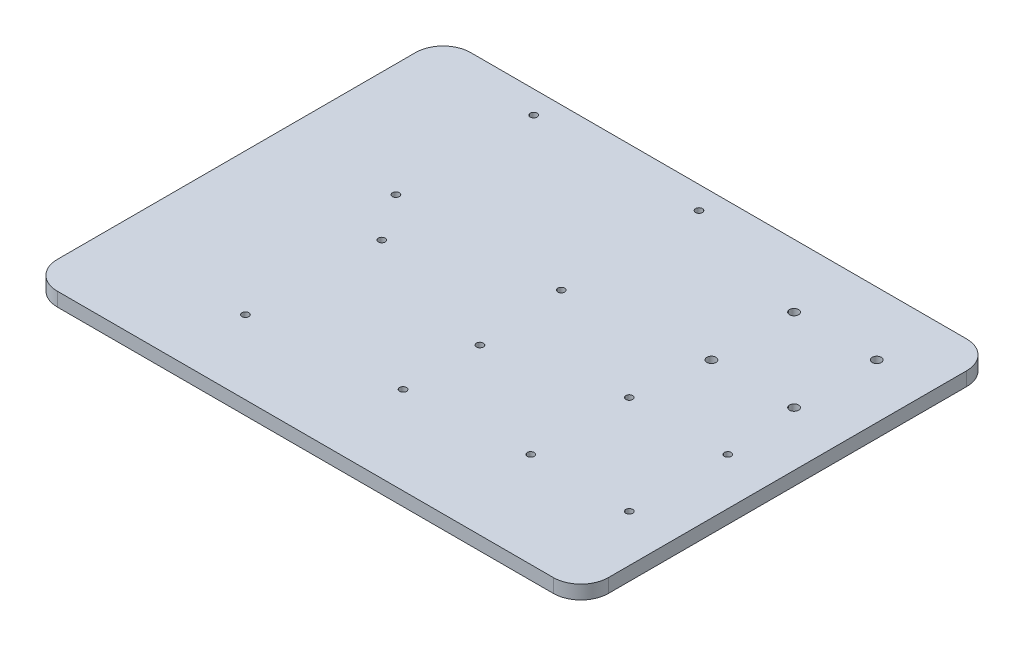
ISO-10303-21;
HEADER;
FILE_DESCRIPTION(('STEP AP214'),'2;1');
FILE_NAME('part.step','',(''),(''),'','','');
FILE_SCHEMA(('AUTOMOTIVE_DESIGN { 1 0 10303 214 1 1 1 1 }'));
ENDSEC;
DATA;
#1=APPLICATION_CONTEXT('core data for automotive mechanical design processes');
#2=APPLICATION_PROTOCOL_DEFINITION('international standard','automotive_design',2000,#1);
#3=PRODUCT_CONTEXT('',#1,'mechanical');
#4=PRODUCT('Part','Part','',(#3));
#5=PRODUCT_RELATED_PRODUCT_CATEGORY('part','',(#4));
#6=PRODUCT_DEFINITION_FORMATION('','',#4);
#7=PRODUCT_DEFINITION_CONTEXT('part definition',#1,'design');
#8=PRODUCT_DEFINITION('design','',#6,#7);
#9=PRODUCT_DEFINITION_SHAPE('','',#8);
#10=(LENGTH_UNIT() NAMED_UNIT(*) SI_UNIT(.MILLI.,.METRE.));
#11=(NAMED_UNIT(*) PLANE_ANGLE_UNIT() SI_UNIT($,.RADIAN.));
#12=(NAMED_UNIT(*) SI_UNIT($,.STERADIAN.) SOLID_ANGLE_UNIT());
#13=UNCERTAINTY_MEASURE_WITH_UNIT(LENGTH_MEASURE(1.E-05),#10,'distance_accuracy_value','');
#14=(GEOMETRIC_REPRESENTATION_CONTEXT(3) GLOBAL_UNCERTAINTY_ASSIGNED_CONTEXT((#13)) GLOBAL_UNIT_ASSIGNED_CONTEXT((#10,
#11,#12)) REPRESENTATION_CONTEXT('',''));
#15=CARTESIAN_POINT('',(0.,0.,0.));
#16=DIRECTION('',(0.,0.,1.));
#17=DIRECTION('',(1.,0.,0.));
#18=AXIS2_PLACEMENT_3D('',#15,#16,#17);
#19=CARTESIAN_POINT('',(-90.0000000000001,0.,65.));
#20=DIRECTION('',(0.,-1.,0.));
#21=DIRECTION('',(0.,0.,-1.));
#22=AXIS2_PLACEMENT_3D('',#19,#20,#21);
#23=PLANE('',#22);
#24=CARTESIAN_POINT('',(-58.9099004654203,0.,-16.7747922849964));
#25=DIRECTION('',(0.,1.,0.));
#26=DIRECTION('',(0.,0.,1.));
#27=AXIS2_PLACEMENT_3D('',#24,#25,#26);
#28=CIRCLE('',#27,1.25);
#29=CARTESIAN_POINT('',(-58.9099004654203,0.,-15.5247922849964));
#30=VERTEX_POINT('',#29);
#31=EDGE_CURVE('E272',#30,#30,#28,.T.);
#32=ORIENTED_EDGE('',*,*,#31,.T.);
#33=EDGE_LOOP('',(#32));
#34=FACE_BOUND('',#33,.T.);
#35=CARTESIAN_POINT('',(1.09009953457967,0.,-16.7747922849964));
#36=DIRECTION('',(0.,1.,0.));
#37=DIRECTION('',(0.,0.,1.));
#38=AXIS2_PLACEMENT_3D('',#35,#36,#37);
#39=CIRCLE('',#38,1.25);
#40=CARTESIAN_POINT('',(1.09009953457967,0.,-15.5247922849964));
#41=VERTEX_POINT('',#40);
#42=EDGE_CURVE('E266',#41,#41,#39,.T.);
#43=ORIENTED_EDGE('',*,*,#42,.T.);
#44=EDGE_LOOP('',(#43));
#45=FACE_BOUND('',#44,.T.);
#46=CARTESIAN_POINT('',(1.0900995345795,0.,-66.7747922849964));
#47=DIRECTION('',(0.,1.,0.));
#48=DIRECTION('',(0.,0.,1.));
#49=AXIS2_PLACEMENT_3D('',#46,#47,#48);
#50=CIRCLE('',#49,1.25);
#51=CARTESIAN_POINT('',(1.0900995345795,0.,-65.5247922849964));
#52=VERTEX_POINT('',#51);
#53=EDGE_CURVE('E260',#52,#52,#50,.T.);
#54=ORIENTED_EDGE('',*,*,#53,.T.);
#55=EDGE_LOOP('',(#54));
#56=FACE_BOUND('',#55,.T.);
#57=CARTESIAN_POINT('',(-90.0000000000001,0.,65.));
#58=DIRECTION('',(0.,-1.,0.));
#59=DIRECTION('',(0.,0.,-1.));
#60=AXIS2_PLACEMENT_3D('',#57,#58,#59);
#61=CIRCLE('',#60,9.99999999999999);
#62=CARTESIAN_POINT('',(-90.0000000000001,0.,75.));
#63=VERTEX_POINT('',#62);
#64=CARTESIAN_POINT('',(-100.,0.,65.));
#65=VERTEX_POINT('',#64);
#66=EDGE_CURVE('E136',#63,#65,#61,.T.);
#67=ORIENTED_EDGE('',*,*,#66,.T.);
#68=DIRECTION('',(0.,0.,-1.));
#69=VECTOR('',#68,1.);
#70=CARTESIAN_POINT('',(-100.,0.,65.));
#71=LINE('',#70,#69);
#72=CARTESIAN_POINT('',(-100.,0.,-65.));
#73=VERTEX_POINT('',#72);
#74=EDGE_CURVE('E139',#65,#73,#71,.T.);
#75=ORIENTED_EDGE('',*,*,#74,.T.);
#76=CARTESIAN_POINT('',(-90.0000000000001,0.,-65.));
#77=DIRECTION('',(0.,-1.,0.));
#78=DIRECTION('',(0.,0.,-1.));
#79=AXIS2_PLACEMENT_3D('',#76,#77,#78);
#80=CIRCLE('',#79,9.99999999999999);
#81=CARTESIAN_POINT('',(-90.0000000000001,0.,-75.));
#82=VERTEX_POINT('',#81);
#83=EDGE_CURVE('E143',#73,#82,#80,.T.);
#84=ORIENTED_EDGE('',*,*,#83,.T.);
#85=DIRECTION('',(1.,0.,0.));
#86=VECTOR('',#85,1.);
#87=CARTESIAN_POINT('',(-90.0000000000001,0.,-75.));
#88=LINE('',#87,#86);
#89=CARTESIAN_POINT('',(90.,0.,-75.));
#90=VERTEX_POINT('',#89);
#91=EDGE_CURVE('E146',#82,#90,#88,.T.);
#92=ORIENTED_EDGE('',*,*,#91,.T.);
#93=CARTESIAN_POINT('',(90.,0.,-65.));
#94=DIRECTION('',(0.,-1.,0.));
#95=DIRECTION('',(0.,0.,-1.));
#96=AXIS2_PLACEMENT_3D('',#93,#94,#95);
#97=CIRCLE('',#96,10.);
#98=CARTESIAN_POINT('',(100.,0.,-65.));
#99=VERTEX_POINT('',#98);
#100=EDGE_CURVE('E149',#90,#99,#97,.T.);
#101=ORIENTED_EDGE('',*,*,#100,.T.);
#102=DIRECTION('',(0.,0.,-1.));
#103=VECTOR('',#102,1.);
#104=CARTESIAN_POINT('',(100.,0.,65.));
#105=LINE('',#104,#103);
#106=CARTESIAN_POINT('',(100.,0.,65.));
#107=VERTEX_POINT('',#106);
#108=EDGE_CURVE('E152',#107,#99,#105,.T.);
#109=ORIENTED_EDGE('',*,*,#108,.F.);
#110=CARTESIAN_POINT('',(90.,0.,65.));
#111=DIRECTION('',(0.,1.,0.));
#112=DIRECTION('',(0.,0.,1.));
#113=AXIS2_PLACEMENT_3D('',#110,#111,#112);
#114=CIRCLE('',#113,10.);
#115=CARTESIAN_POINT('',(90.,0.,75.));
#116=VERTEX_POINT('',#115);
#117=EDGE_CURVE('E121',#116,#107,#114,.T.);
#118=ORIENTED_EDGE('',*,*,#117,.F.);
#119=DIRECTION('',(1.,0.,0.));
#120=VECTOR('',#119,1.);
#121=CARTESIAN_POINT('',(-90.0000000000001,0.,75.));
#122=LINE('',#121,#120);
#123=EDGE_CURVE('E81',#63,#116,#122,.T.);
#124=ORIENTED_EDGE('',*,*,#123,.F.);
#125=EDGE_LOOP('',(#67,#75,#84,#92,#101,#109,#118,#124));
#126=FACE_BOUND('',#125,.T.);
#127=CARTESIAN_POINT('',(-48.490955355582,0.,48.2497848916603));
#128=DIRECTION('',(0.,1.,0.));
#129=DIRECTION('',(0.,0.,1.));
#130=AXIS2_PLACEMENT_3D('',#127,#128,#129);
#131=CIRCLE('',#130,1.25);
#132=CARTESIAN_POINT('',(-48.490955355582,0.,49.4997848916603));
#133=VERTEX_POINT('',#132);
#134=EDGE_CURVE('E140',#133,#133,#131,.T.);
#135=ORIENTED_EDGE('',*,*,#134,.T.);
#136=EDGE_LOOP('',(#135));
#137=FACE_BOUND('',#136,.T.);
#138=CARTESIAN_POINT('',(-47.190955355582,0.,0.0497848916603538));
#139=DIRECTION('',(0.,1.,0.));
#140=DIRECTION('',(0.,0.,1.));
#141=AXIS2_PLACEMENT_3D('',#138,#139,#140);
#142=CIRCLE('',#141,1.25);
#143=CARTESIAN_POINT('',(-47.190955355582,0.,1.29978489166035));
#144=VERTEX_POINT('',#143);
#145=EDGE_CURVE('E188',#144,#144,#142,.T.);
#146=ORIENTED_EDGE('',*,*,#145,.T.);
#147=EDGE_LOOP('',(#146));
#148=FACE_BOUND('',#147,.T.);
#149=CARTESIAN_POINT('',(3.60904464441801,0.,43.1497848916604));
#150=DIRECTION('',(0.,1.,0.));
#151=DIRECTION('',(0.,0.,1.));
#152=AXIS2_PLACEMENT_3D('',#149,#150,#151);
#153=CIRCLE('',#152,1.25);
#154=CARTESIAN_POINT('',(3.60904464441801,0.,44.3997848916604));
#155=VERTEX_POINT('',#154);
#156=EDGE_CURVE('E194',#155,#155,#153,.T.);
#157=ORIENTED_EDGE('',*,*,#156,.T.);
#158=EDGE_LOOP('',(#157));
#159=FACE_BOUND('',#158,.T.);
#160=CARTESIAN_POINT('',(3.60904464441801,0.,15.2497848916603));
#161=DIRECTION('',(0.,1.,0.));
#162=DIRECTION('',(0.,0.,1.));
#163=AXIS2_PLACEMENT_3D('',#160,#161,#162);
#164=CIRCLE('',#163,1.25);
#165=CARTESIAN_POINT('',(3.60904464441801,0.,16.4997848916603));
#166=VERTEX_POINT('',#165);
#167=EDGE_CURVE('E200',#166,#166,#164,.T.);
#168=ORIENTED_EDGE('',*,*,#167,.T.);
#169=EDGE_LOOP('',(#168));
#170=FACE_BOUND('',#169,.T.);
#171=CARTESIAN_POINT('',(47.2018733772672,0.,4.64918051198569));
#172=DIRECTION('',(0.,1.,0.));
#173=DIRECTION('',(0.,0.,1.));
#174=AXIS2_PLACEMENT_3D('',#171,#172,#173);
#175=CIRCLE('',#174,1.24999999999999);
#176=CARTESIAN_POINT('',(47.2018733772672,0.,5.89918051198568));
#177=VERTEX_POINT('',#176);
#178=EDGE_CURVE('E206',#177,#177,#175,.T.);
#179=ORIENTED_EDGE('',*,*,#178,.T.);
#180=EDGE_LOOP('',(#179));
#181=FACE_BOUND('',#180,.T.);
#182=CARTESIAN_POINT('',(82.9618733772672,0.,4.64918051198569));
#183=DIRECTION('',(0.,1.,0.));
#184=DIRECTION('',(0.,0.,1.));
#185=AXIS2_PLACEMENT_3D('',#182,#183,#184);
#186=CIRCLE('',#185,1.24999999999999);
#187=CARTESIAN_POINT('',(82.9618733772672,0.,5.89918051198568));
#188=VERTEX_POINT('',#187);
#189=EDGE_CURVE('E212',#188,#188,#186,.T.);
#190=ORIENTED_EDGE('',*,*,#189,.T.);
#191=EDGE_LOOP('',(#190));
#192=FACE_BOUND('',#191,.T.);
#193=CARTESIAN_POINT('',(82.9618733772674,0.,40.4091805119857));
#194=DIRECTION('',(0.,1.,0.));
#195=DIRECTION('',(0.,0.,1.));
#196=AXIS2_PLACEMENT_3D('',#193,#194,#195);
#197=CIRCLE('',#196,1.24999999999999);
#198=CARTESIAN_POINT('',(82.9618733772674,0.,41.6591805119857));
#199=VERTEX_POINT('',#198);
#200=EDGE_CURVE('E218',#199,#199,#197,.T.);
#201=ORIENTED_EDGE('',*,*,#200,.T.);
#202=EDGE_LOOP('',(#201));
#203=FACE_BOUND('',#202,.T.);
#204=CARTESIAN_POINT('',(47.2018733772674,0.,40.4091805119857));
#205=DIRECTION('',(0.,1.,0.));
#206=DIRECTION('',(0.,0.,1.));
#207=AXIS2_PLACEMENT_3D('',#204,#205,#206);
#208=CIRCLE('',#207,1.24999999999999);
#209=CARTESIAN_POINT('',(47.2018733772674,0.,41.6591805119857));
#210=VERTEX_POINT('',#209);
#211=EDGE_CURVE('E224',#210,#210,#208,.T.);
#212=ORIENTED_EDGE('',*,*,#211,.T.);
#213=EDGE_LOOP('',(#212));
#214=FACE_BOUND('',#213,.T.);
#215=CARTESIAN_POINT('',(50.2730350442184,0.,-52.0977986039124));
#216=DIRECTION('',(0.,1.,0.));
#217=DIRECTION('',(0.,0.,1.));
#218=AXIS2_PLACEMENT_3D('',#215,#216,#217);
#219=CIRCLE('',#218,1.65);
#220=CARTESIAN_POINT('',(50.2730350442184,0.,-50.4477986039124));
#221=VERTEX_POINT('',#220);
#222=EDGE_CURVE('E230',#221,#221,#219,.T.);
#223=ORIENTED_EDGE('',*,*,#222,.T.);
#224=EDGE_LOOP('',(#223));
#225=FACE_BOUND('',#224,.T.);
#226=CARTESIAN_POINT('',(80.2730350442184,0.,-52.0977986039124));
#227=DIRECTION('',(0.,1.,0.));
#228=DIRECTION('',(0.,0.,1.));
#229=AXIS2_PLACEMENT_3D('',#226,#227,#228);
#230=CIRCLE('',#229,1.65);
#231=CARTESIAN_POINT('',(80.2730350442184,0.,-50.4477986039124));
#232=VERTEX_POINT('',#231);
#233=EDGE_CURVE('E236',#232,#232,#230,.T.);
#234=ORIENTED_EDGE('',*,*,#233,.T.);
#235=EDGE_LOOP('',(#234));
#236=FACE_BOUND('',#235,.T.);
#237=CARTESIAN_POINT('',(80.2730350442185,0.,-22.0977986039124));
#238=DIRECTION('',(0.,1.,0.));
#239=DIRECTION('',(0.,0.,1.));
#240=AXIS2_PLACEMENT_3D('',#237,#238,#239);
#241=CIRCLE('',#240,1.65);
#242=CARTESIAN_POINT('',(80.2730350442185,0.,-20.4477986039124));
#243=VERTEX_POINT('',#242);
#244=EDGE_CURVE('E242',#243,#243,#241,.T.);
#245=ORIENTED_EDGE('',*,*,#244,.T.);
#246=EDGE_LOOP('',(#245));
#247=FACE_BOUND('',#246,.T.);
#248=CARTESIAN_POINT('',(50.2730350442185,0.,-22.0977986039124));
#249=DIRECTION('',(0.,1.,0.));
#250=DIRECTION('',(0.,0.,1.));
#251=AXIS2_PLACEMENT_3D('',#248,#249,#250);
#252=CIRCLE('',#251,1.65);
#253=CARTESIAN_POINT('',(50.2730350442185,0.,-20.4477986039124));
#254=VERTEX_POINT('',#253);
#255=EDGE_CURVE('E248',#254,#254,#252,.T.);
#256=ORIENTED_EDGE('',*,*,#255,.T.);
#257=EDGE_LOOP('',(#256));
#258=FACE_BOUND('',#257,.T.);
#259=CARTESIAN_POINT('',(-58.9099004654205,0.,-66.7747922849964));
#260=DIRECTION('',(0.,1.,0.));
#261=DIRECTION('',(0.,0.,1.));
#262=AXIS2_PLACEMENT_3D('',#259,#260,#261);
#263=CIRCLE('',#262,1.25);
#264=CARTESIAN_POINT('',(-58.9099004654205,0.,-65.5247922849964));
#265=VERTEX_POINT('',#264);
#266=EDGE_CURVE('E254',#265,#265,#263,.T.);
#267=ORIENTED_EDGE('',*,*,#266,.T.);
#268=EDGE_LOOP('',(#267));
#269=FACE_BOUND('',#268,.T.);
#270=ADVANCED_FACE('F35',(#34,#45,#56,#126,#137,#148,#159,#170,#181,#192,#203,#214,#225,#236,
#247,#258,#269),#23,.T.);
#271=CARTESIAN_POINT('',(-90.0000000000001,5.,65.));
#272=DIRECTION('',(0.,-1.,0.));
#273=DIRECTION('',(0.,0.,-1.));
#274=AXIS2_PLACEMENT_3D('',#271,#272,#273);
#275=PLANE('',#274);
#276=CARTESIAN_POINT('',(-58.9099004654203,5.,-16.7747922849964));
#277=DIRECTION('',(0.,1.,0.));
#278=DIRECTION('',(0.,0.,1.));
#279=AXIS2_PLACEMENT_3D('',#276,#277,#278);
#280=CIRCLE('',#279,1.24999999999999);
#281=CARTESIAN_POINT('',(-58.9099004654203,5.,-15.5247922849964));
#282=VERTEX_POINT('',#281);
#283=EDGE_CURVE('E275',#282,#282,#280,.T.);
#284=ORIENTED_EDGE('',*,*,#283,.F.);
#285=EDGE_LOOP('',(#284));
#286=FACE_BOUND('',#285,.T.);
#287=CARTESIAN_POINT('',(1.09009953457967,5.,-16.7747922849964));
#288=DIRECTION('',(0.,1.,0.));
#289=DIRECTION('',(0.,0.,1.));
#290=AXIS2_PLACEMENT_3D('',#287,#288,#289);
#291=CIRCLE('',#290,1.24999999999999);
#292=CARTESIAN_POINT('',(1.09009953457967,5.,-15.5247922849964));
#293=VERTEX_POINT('',#292);
#294=EDGE_CURVE('E269',#293,#293,#291,.T.);
#295=ORIENTED_EDGE('',*,*,#294,.F.);
#296=EDGE_LOOP('',(#295));
#297=FACE_BOUND('',#296,.T.);
#298=CARTESIAN_POINT('',(1.0900995345795,5.,-66.7747922849964));
#299=DIRECTION('',(0.,1.,0.));
#300=DIRECTION('',(0.,0.,1.));
#301=AXIS2_PLACEMENT_3D('',#298,#299,#300);
#302=CIRCLE('',#301,1.24999999999999);
#303=CARTESIAN_POINT('',(1.0900995345795,5.,-65.5247922849964));
#304=VERTEX_POINT('',#303);
#305=EDGE_CURVE('E263',#304,#304,#302,.T.);
#306=ORIENTED_EDGE('',*,*,#305,.F.);
#307=EDGE_LOOP('',(#306));
#308=FACE_BOUND('',#307,.T.);
#309=CARTESIAN_POINT('',(50.2730350442185,5.,-22.0977986039124));
#310=DIRECTION('',(0.,1.,0.));
#311=DIRECTION('',(0.,0.,1.));
#312=AXIS2_PLACEMENT_3D('',#309,#310,#311);
#313=CIRCLE('',#312,1.65);
#314=CARTESIAN_POINT('',(50.2730350442185,5.,-20.4477986039124));
#315=VERTEX_POINT('',#314);
#316=EDGE_CURVE('E251',#315,#315,#313,.T.);
#317=ORIENTED_EDGE('',*,*,#316,.F.);
#318=EDGE_LOOP('',(#317));
#319=FACE_BOUND('',#318,.T.);
#320=CARTESIAN_POINT('',(80.2730350442185,5.,-22.0977986039124));
#321=DIRECTION('',(0.,1.,0.));
#322=DIRECTION('',(0.,0.,1.));
#323=AXIS2_PLACEMENT_3D('',#320,#321,#322);
#324=CIRCLE('',#323,1.65);
#325=CARTESIAN_POINT('',(80.2730350442185,5.,-20.4477986039124));
#326=VERTEX_POINT('',#325);
#327=EDGE_CURVE('E245',#326,#326,#324,.T.);
#328=ORIENTED_EDGE('',*,*,#327,.F.);
#329=EDGE_LOOP('',(#328));
#330=FACE_BOUND('',#329,.T.);
#331=CARTESIAN_POINT('',(80.2730350442184,5.,-52.0977986039124));
#332=DIRECTION('',(0.,1.,0.));
#333=DIRECTION('',(0.,0.,1.));
#334=AXIS2_PLACEMENT_3D('',#331,#332,#333);
#335=CIRCLE('',#334,1.65);
#336=CARTESIAN_POINT('',(80.2730350442184,5.,-50.4477986039124));
#337=VERTEX_POINT('',#336);
#338=EDGE_CURVE('E239',#337,#337,#335,.T.);
#339=ORIENTED_EDGE('',*,*,#338,.F.);
#340=EDGE_LOOP('',(#339));
#341=FACE_BOUND('',#340,.T.);
#342=CARTESIAN_POINT('',(50.2730350442184,5.,-52.0977986039124));
#343=DIRECTION('',(0.,1.,0.));
#344=DIRECTION('',(0.,0.,1.));
#345=AXIS2_PLACEMENT_3D('',#342,#343,#344);
#346=CIRCLE('',#345,1.65);
#347=CARTESIAN_POINT('',(50.2730350442184,5.,-50.4477986039124));
#348=VERTEX_POINT('',#347);
#349=EDGE_CURVE('E233',#348,#348,#346,.T.);
#350=ORIENTED_EDGE('',*,*,#349,.F.);
#351=EDGE_LOOP('',(#350));
#352=FACE_BOUND('',#351,.T.);
#353=CARTESIAN_POINT('',(47.2018733772674,5.,40.4091805119857));
#354=DIRECTION('',(0.,1.,0.));
#355=DIRECTION('',(0.,0.,1.));
#356=AXIS2_PLACEMENT_3D('',#353,#354,#355);
#357=CIRCLE('',#356,1.24999999999999);
#358=CARTESIAN_POINT('',(47.2018733772674,5.,41.6591805119857));
#359=VERTEX_POINT('',#358);
#360=EDGE_CURVE('E227',#359,#359,#357,.T.);
#361=ORIENTED_EDGE('',*,*,#360,.F.);
#362=EDGE_LOOP('',(#361));
#363=FACE_BOUND('',#362,.T.);
#364=CARTESIAN_POINT('',(82.9618733772674,5.,40.4091805119857));
#365=DIRECTION('',(0.,1.,0.));
#366=DIRECTION('',(0.,0.,1.));
#367=AXIS2_PLACEMENT_3D('',#364,#365,#366);
#368=CIRCLE('',#367,1.24999999999999);
#369=CARTESIAN_POINT('',(82.9618733772674,5.,41.6591805119857));
#370=VERTEX_POINT('',#369);
#371=EDGE_CURVE('E221',#370,#370,#368,.T.);
#372=ORIENTED_EDGE('',*,*,#371,.F.);
#373=EDGE_LOOP('',(#372));
#374=FACE_BOUND('',#373,.T.);
#375=CARTESIAN_POINT('',(82.9618733772672,5.,4.64918051198569));
#376=DIRECTION('',(0.,1.,0.));
#377=DIRECTION('',(0.,0.,1.));
#378=AXIS2_PLACEMENT_3D('',#375,#376,#377);
#379=CIRCLE('',#378,1.24999999999999);
#380=CARTESIAN_POINT('',(82.9618733772672,5.,5.89918051198568));
#381=VERTEX_POINT('',#380);
#382=EDGE_CURVE('E215',#381,#381,#379,.T.);
#383=ORIENTED_EDGE('',*,*,#382,.F.);
#384=EDGE_LOOP('',(#383));
#385=FACE_BOUND('',#384,.T.);
#386=CARTESIAN_POINT('',(47.2018733772672,5.,4.64918051198569));
#387=DIRECTION('',(0.,1.,0.));
#388=DIRECTION('',(0.,0.,1.));
#389=AXIS2_PLACEMENT_3D('',#386,#387,#388);
#390=CIRCLE('',#389,1.24999999999999);
#391=CARTESIAN_POINT('',(47.2018733772672,5.,5.89918051198568));
#392=VERTEX_POINT('',#391);
#393=EDGE_CURVE('E209',#392,#392,#390,.T.);
#394=ORIENTED_EDGE('',*,*,#393,.F.);
#395=EDGE_LOOP('',(#394));
#396=FACE_BOUND('',#395,.T.);
#397=CARTESIAN_POINT('',(3.60904464441801,5.,15.2497848916603));
#398=DIRECTION('',(0.,1.,0.));
#399=DIRECTION('',(0.,0.,1.));
#400=AXIS2_PLACEMENT_3D('',#397,#398,#399);
#401=CIRCLE('',#400,1.25);
#402=CARTESIAN_POINT('',(3.60904464441801,5.,16.4997848916603));
#403=VERTEX_POINT('',#402);
#404=EDGE_CURVE('E203',#403,#403,#401,.T.);
#405=ORIENTED_EDGE('',*,*,#404,.F.);
#406=EDGE_LOOP('',(#405));
#407=FACE_BOUND('',#406,.T.);
#408=CARTESIAN_POINT('',(3.60904464441801,5.,43.1497848916604));
#409=DIRECTION('',(0.,1.,0.));
#410=DIRECTION('',(0.,0.,1.));
#411=AXIS2_PLACEMENT_3D('',#408,#409,#410);
#412=CIRCLE('',#411,1.25);
#413=CARTESIAN_POINT('',(3.60904464441801,5.,44.3997848916604));
#414=VERTEX_POINT('',#413);
#415=EDGE_CURVE('E197',#414,#414,#412,.T.);
#416=ORIENTED_EDGE('',*,*,#415,.F.);
#417=EDGE_LOOP('',(#416));
#418=FACE_BOUND('',#417,.T.);
#419=CARTESIAN_POINT('',(-47.190955355582,5.,0.0497848916603538));
#420=DIRECTION('',(0.,1.,0.));
#421=DIRECTION('',(0.,0.,1.));
#422=AXIS2_PLACEMENT_3D('',#419,#420,#421);
#423=CIRCLE('',#422,1.25);
#424=CARTESIAN_POINT('',(-47.190955355582,5.,1.29978489166035));
#425=VERTEX_POINT('',#424);
#426=EDGE_CURVE('E191',#425,#425,#423,.T.);
#427=ORIENTED_EDGE('',*,*,#426,.F.);
#428=EDGE_LOOP('',(#427));
#429=FACE_BOUND('',#428,.T.);
#430=CARTESIAN_POINT('',(-48.490955355582,5.,48.2497848916603));
#431=DIRECTION('',(0.,1.,0.));
#432=DIRECTION('',(0.,0.,1.));
#433=AXIS2_PLACEMENT_3D('',#430,#431,#432);
#434=CIRCLE('',#433,1.25);
#435=CARTESIAN_POINT('',(-48.490955355582,5.,49.4997848916603));
#436=VERTEX_POINT('',#435);
#437=EDGE_CURVE('E185',#436,#436,#434,.T.);
#438=ORIENTED_EDGE('',*,*,#437,.F.);
#439=EDGE_LOOP('',(#438));
#440=FACE_BOUND('',#439,.T.);
#441=CARTESIAN_POINT('',(-90.0000000000001,5.,65.));
#442=DIRECTION('',(0.,-1.,0.));
#443=DIRECTION('',(0.,0.,-1.));
#444=AXIS2_PLACEMENT_3D('',#441,#442,#443);
#445=CIRCLE('',#444,9.99999999999999);
#446=CARTESIAN_POINT('',(-90.0000000000001,5.,75.));
#447=VERTEX_POINT('',#446);
#448=CARTESIAN_POINT('',(-100.,5.,65.));
#449=VERTEX_POINT('',#448);
#450=EDGE_CURVE('E155',#447,#449,#445,.T.);
#451=ORIENTED_EDGE('',*,*,#450,.F.);
#452=DIRECTION('',(1.,0.,0.));
#453=VECTOR('',#452,1.);
#454=CARTESIAN_POINT('',(-90.0000000000001,5.,75.));
#455=LINE('',#454,#453);
#456=CARTESIAN_POINT('',(90.,5.,75.));
#457=VERTEX_POINT('',#456);
#458=EDGE_CURVE('E114',#447,#457,#455,.T.);
#459=ORIENTED_EDGE('',*,*,#458,.T.);
#460=CARTESIAN_POINT('',(90.,5.,65.));
#461=DIRECTION('',(0.,1.,0.));
#462=DIRECTION('',(0.,0.,1.));
#463=AXIS2_PLACEMENT_3D('',#460,#461,#462);
#464=CIRCLE('',#463,10.);
#465=CARTESIAN_POINT('',(100.,5.,65.));
#466=VERTEX_POINT('',#465);
#467=EDGE_CURVE('E105',#457,#466,#464,.T.);
#468=ORIENTED_EDGE('',*,*,#467,.T.);
#469=DIRECTION('',(0.,0.,-1.));
#470=VECTOR('',#469,1.);
#471=CARTESIAN_POINT('',(100.,5.,65.));
#472=LINE('',#471,#470);
#473=CARTESIAN_POINT('',(100.,5.,-65.));
#474=VERTEX_POINT('',#473);
#475=EDGE_CURVE('E112',#466,#474,#472,.T.);
#476=ORIENTED_EDGE('',*,*,#475,.T.);
#477=CARTESIAN_POINT('',(90.,5.,-65.));
#478=DIRECTION('',(0.,-1.,0.));
#479=DIRECTION('',(0.,0.,-1.));
#480=AXIS2_PLACEMENT_3D('',#477,#478,#479);
#481=CIRCLE('',#480,10.);
#482=CARTESIAN_POINT('',(90.,5.,-75.));
#483=VERTEX_POINT('',#482);
#484=EDGE_CURVE('E129',#483,#474,#481,.T.);
#485=ORIENTED_EDGE('',*,*,#484,.F.);
#486=DIRECTION('',(1.,0.,0.));
#487=VECTOR('',#486,1.);
#488=CARTESIAN_POINT('',(-90.0000000000001,5.,-75.));
#489=LINE('',#488,#487);
#490=CARTESIAN_POINT('',(-90.0000000000001,5.,-75.));
#491=VERTEX_POINT('',#490);
#492=EDGE_CURVE('E131',#491,#483,#489,.T.);
#493=ORIENTED_EDGE('',*,*,#492,.F.);
#494=CARTESIAN_POINT('',(-90.0000000000001,5.,-65.));
#495=DIRECTION('',(0.,-1.,0.));
#496=DIRECTION('',(0.,0.,-1.));
#497=AXIS2_PLACEMENT_3D('',#494,#495,#496);
#498=CIRCLE('',#497,9.99999999999999);
#499=CARTESIAN_POINT('',(-100.,5.,-65.));
#500=VERTEX_POINT('',#499);
#501=EDGE_CURVE('E177',#500,#491,#498,.T.);
#502=ORIENTED_EDGE('',*,*,#501,.F.);
#503=DIRECTION('',(0.,0.,-1.));
#504=VECTOR('',#503,1.);
#505=CARTESIAN_POINT('',(-100.,5.,65.));
#506=LINE('',#505,#504);
#507=EDGE_CURVE('E178',#449,#500,#506,.T.);
#508=ORIENTED_EDGE('',*,*,#507,.F.);
#509=EDGE_LOOP('',(#451,#459,#468,#476,#485,#493,#502,#508));
#510=FACE_BOUND('',#509,.T.);
#511=CARTESIAN_POINT('',(-58.9099004654205,5.,-66.7747922849964));
#512=DIRECTION('',(0.,1.,0.));
#513=DIRECTION('',(0.,0.,1.));
#514=AXIS2_PLACEMENT_3D('',#511,#512,#513);
#515=CIRCLE('',#514,1.24999999999999);
#516=CARTESIAN_POINT('',(-58.9099004654205,5.,-65.5247922849964));
#517=VERTEX_POINT('',#516);
#518=EDGE_CURVE('E257',#517,#517,#515,.T.);
#519=ORIENTED_EDGE('',*,*,#518,.F.);
#520=EDGE_LOOP('',(#519));
#521=FACE_BOUND('',#520,.T.);
#522=ADVANCED_FACE('F108',(#286,#297,#308,#319,#330,#341,#352,#363,#374,#385,#396,#407,#418,
#429,#440,#510,#521),#275,.F.);
#523=CARTESIAN_POINT('',(-90.0000000000001,5.,65.));
#524=DIRECTION('',(0.,-1.,0.));
#525=DIRECTION('',(0.,0.,-1.));
#526=AXIS2_PLACEMENT_3D('',#523,#524,#525);
#527=CYLINDRICAL_SURFACE('',#526,9.99999999999999);
#528=ORIENTED_EDGE('',*,*,#66,.F.);
#529=DIRECTION('',(0.,-1.,0.));
#530=VECTOR('',#529,1.);
#531=CARTESIAN_POINT('',(-90.0000000000001,5.,75.));
#532=LINE('',#531,#530);
#533=EDGE_CURVE('E11',#447,#63,#532,.T.);
#534=ORIENTED_EDGE('',*,*,#533,.F.);
#535=ORIENTED_EDGE('',*,*,#450,.T.);
#536=DIRECTION('',(0.,-1.,0.));
#537=VECTOR('',#536,1.);
#538=CARTESIAN_POINT('',(-100.,5.,65.));
#539=LINE('',#538,#537);
#540=EDGE_CURVE('E39',#449,#65,#539,.T.);
#541=ORIENTED_EDGE('',*,*,#540,.T.);
#542=EDGE_LOOP('',(#528,#534,#535,#541));
#543=FACE_BOUND('',#542,.T.);
#544=ADVANCED_FACE('F37',(#543),#527,.T.);
#545=CARTESIAN_POINT('',(-90.0000000000001,5.,75.));
#546=DIRECTION('',(0.,0.,-1.));
#547=DIRECTION('',(-1.,0.,0.));
#548=AXIS2_PLACEMENT_3D('',#545,#546,#547);
#549=PLANE('',#548);
#550=ORIENTED_EDGE('',*,*,#123,.T.);
#551=DIRECTION('',(0.,-1.,0.));
#552=VECTOR('',#551,1.);
#553=CARTESIAN_POINT('',(90.,5.,75.));
#554=LINE('',#553,#552);
#555=EDGE_CURVE('E45',#457,#116,#554,.T.);
#556=ORIENTED_EDGE('',*,*,#555,.F.);
#557=ORIENTED_EDGE('',*,*,#458,.F.);
#558=ORIENTED_EDGE('',*,*,#533,.T.);
#559=EDGE_LOOP('',(#550,#556,#557,#558));
#560=FACE_BOUND('',#559,.T.);
#561=ADVANCED_FACE('F333',(#560),#549,.F.);
#562=CARTESIAN_POINT('',(90.,5.,65.));
#563=DIRECTION('',(0.,-1.,0.));
#564=DIRECTION('',(0.,0.,-1.));
#565=AXIS2_PLACEMENT_3D('',#562,#563,#564);
#566=CYLINDRICAL_SURFACE('',#565,10.);
#567=ORIENTED_EDGE('',*,*,#117,.T.);
#568=DIRECTION('',(0.,-1.,0.));
#569=VECTOR('',#568,1.);
#570=CARTESIAN_POINT('',(100.,5.,65.));
#571=LINE('',#570,#569);
#572=EDGE_CURVE('E118',#466,#107,#571,.T.);
#573=ORIENTED_EDGE('',*,*,#572,.F.);
#574=ORIENTED_EDGE('',*,*,#467,.F.);
#575=ORIENTED_EDGE('',*,*,#555,.T.);
#576=EDGE_LOOP('',(#567,#573,#574,#575));
#577=FACE_BOUND('',#576,.T.);
#578=ADVANCED_FACE('F119',(#577),#566,.T.);
#579=CARTESIAN_POINT('',(100.,5.,65.));
#580=DIRECTION('',(-1.,0.,0.));
#581=DIRECTION('',(0.,0.,1.));
#582=AXIS2_PLACEMENT_3D('',#579,#580,#581);
#583=PLANE('',#582);
#584=ORIENTED_EDGE('',*,*,#108,.T.);
#585=DIRECTION('',(0.,-1.,0.));
#586=VECTOR('',#585,1.);
#587=CARTESIAN_POINT('',(100.,5.,-65.));
#588=LINE('',#587,#586);
#589=EDGE_CURVE('E125',#474,#99,#588,.T.);
#590=ORIENTED_EDGE('',*,*,#589,.F.);
#591=ORIENTED_EDGE('',*,*,#475,.F.);
#592=ORIENTED_EDGE('',*,*,#572,.T.);
#593=EDGE_LOOP('',(#584,#590,#591,#592));
#594=FACE_BOUND('',#593,.T.);
#595=ADVANCED_FACE('F127',(#594),#583,.F.);
#596=CARTESIAN_POINT('',(90.,5.,-65.));
#597=DIRECTION('',(0.,-1.,0.));
#598=DIRECTION('',(0.,0.,-1.));
#599=AXIS2_PLACEMENT_3D('',#596,#597,#598);
#600=CYLINDRICAL_SURFACE('',#599,10.);
#601=ORIENTED_EDGE('',*,*,#100,.F.);
#602=DIRECTION('',(0.,-1.,0.));
#603=VECTOR('',#602,1.);
#604=CARTESIAN_POINT('',(90.,5.,-75.));
#605=LINE('',#604,#603);
#606=EDGE_CURVE('E159',#483,#90,#605,.T.);
#607=ORIENTED_EDGE('',*,*,#606,.F.);
#608=ORIENTED_EDGE('',*,*,#484,.T.);
#609=ORIENTED_EDGE('',*,*,#589,.T.);
#610=EDGE_LOOP('',(#601,#607,#608,#609));
#611=FACE_BOUND('',#610,.T.);
#612=ADVANCED_FACE('F170',(#611),#600,.T.);
#613=CARTESIAN_POINT('',(-90.0000000000001,5.,-75.));
#614=DIRECTION('',(0.,0.,-1.));
#615=DIRECTION('',(-1.,0.,0.));
#616=AXIS2_PLACEMENT_3D('',#613,#614,#615);
#617=PLANE('',#616);
#618=ORIENTED_EDGE('',*,*,#91,.F.);
#619=DIRECTION('',(0.,-1.,0.));
#620=VECTOR('',#619,1.);
#621=CARTESIAN_POINT('',(-90.0000000000001,5.,-75.));
#622=LINE('',#621,#620);
#623=EDGE_CURVE('E161',#491,#82,#622,.T.);
#624=ORIENTED_EDGE('',*,*,#623,.F.);
#625=ORIENTED_EDGE('',*,*,#492,.T.);
#626=ORIENTED_EDGE('',*,*,#606,.T.);
#627=EDGE_LOOP('',(#618,#624,#625,#626));
#628=FACE_BOUND('',#627,.T.);
#629=ADVANCED_FACE('F176',(#628),#617,.T.);
#630=CARTESIAN_POINT('',(-90.0000000000001,5.,-65.));
#631=DIRECTION('',(0.,-1.,0.));
#632=DIRECTION('',(0.,0.,-1.));
#633=AXIS2_PLACEMENT_3D('',#630,#631,#632);
#634=CYLINDRICAL_SURFACE('',#633,9.99999999999999);
#635=ORIENTED_EDGE('',*,*,#83,.F.);
#636=DIRECTION('',(0.,-1.,0.));
#637=VECTOR('',#636,1.);
#638=CARTESIAN_POINT('',(-100.,5.,-65.));
#639=LINE('',#638,#637);
#640=EDGE_CURVE('E162',#500,#73,#639,.T.);
#641=ORIENTED_EDGE('',*,*,#640,.F.);
#642=ORIENTED_EDGE('',*,*,#501,.T.);
#643=ORIENTED_EDGE('',*,*,#623,.T.);
#644=EDGE_LOOP('',(#635,#641,#642,#643));
#645=FACE_BOUND('',#644,.T.);
#646=ADVANCED_FACE('F324',(#645),#634,.T.);
#647=CARTESIAN_POINT('',(-100.,5.,65.));
#648=DIRECTION('',(-1.,0.,0.));
#649=DIRECTION('',(0.,0.,1.));
#650=AXIS2_PLACEMENT_3D('',#647,#648,#649);
#651=PLANE('',#650);
#652=ORIENTED_EDGE('',*,*,#74,.F.);
#653=ORIENTED_EDGE('',*,*,#540,.F.);
#654=ORIENTED_EDGE('',*,*,#507,.T.);
#655=ORIENTED_EDGE('',*,*,#640,.T.);
#656=EDGE_LOOP('',(#652,#653,#654,#655));
#657=FACE_BOUND('',#656,.T.);
#658=ADVANCED_FACE('F164',(#657),#651,.T.);
#659=CARTESIAN_POINT('',(-48.490955355582,5.,48.2497848916603));
#660=DIRECTION('',(0.,1.,0.));
#661=DIRECTION('',(0.,0.,1.));
#662=AXIS2_PLACEMENT_3D('',#659,#660,#661);
#663=CYLINDRICAL_SURFACE('',#662,1.25);
#664=ORIENTED_EDGE('',*,*,#134,.F.);
#665=EDGE_LOOP('',(#664));
#666=FACE_BOUND('',#665,.T.);
#667=ORIENTED_EDGE('',*,*,#437,.T.);
#668=EDGE_LOOP('',(#667));
#669=FACE_BOUND('',#668,.T.);
#670=ADVANCED_FACE('F312',(#666,#669),#663,.F.);
#671=CARTESIAN_POINT('',(-47.190955355582,5.,0.0497848916603538));
#672=DIRECTION('',(0.,1.,0.));
#673=DIRECTION('',(0.,0.,1.));
#674=AXIS2_PLACEMENT_3D('',#671,#672,#673);
#675=CYLINDRICAL_SURFACE('',#674,1.25);
#676=ORIENTED_EDGE('',*,*,#145,.F.);
#677=EDGE_LOOP('',(#676));
#678=FACE_BOUND('',#677,.T.);
#679=ORIENTED_EDGE('',*,*,#426,.T.);
#680=EDGE_LOOP('',(#679));
#681=FACE_BOUND('',#680,.T.);
#682=ADVANCED_FACE('F314',(#678,#681),#675,.F.);
#683=CARTESIAN_POINT('',(3.60904464441801,5.,43.1497848916604));
#684=DIRECTION('',(0.,1.,0.));
#685=DIRECTION('',(0.,0.,1.));
#686=AXIS2_PLACEMENT_3D('',#683,#684,#685);
#687=CYLINDRICAL_SURFACE('',#686,1.25);
#688=ORIENTED_EDGE('',*,*,#156,.F.);
#689=EDGE_LOOP('',(#688));
#690=FACE_BOUND('',#689,.T.);
#691=ORIENTED_EDGE('',*,*,#415,.T.);
#692=EDGE_LOOP('',(#691));
#693=FACE_BOUND('',#692,.T.);
#694=ADVANCED_FACE('F321',(#690,#693),#687,.F.);
#695=CARTESIAN_POINT('',(3.60904464441801,5.,15.2497848916603));
#696=DIRECTION('',(0.,1.,0.));
#697=DIRECTION('',(0.,0.,1.));
#698=AXIS2_PLACEMENT_3D('',#695,#696,#697);
#699=CYLINDRICAL_SURFACE('',#698,1.25);
#700=ORIENTED_EDGE('',*,*,#167,.F.);
#701=EDGE_LOOP('',(#700));
#702=FACE_BOUND('',#701,.T.);
#703=ORIENTED_EDGE('',*,*,#404,.T.);
#704=EDGE_LOOP('',(#703));
#705=FACE_BOUND('',#704,.T.);
#706=ADVANCED_FACE('F377',(#702,#705),#699,.F.);
#707=CARTESIAN_POINT('',(47.2018733772672,5.,4.64918051198569));
#708=DIRECTION('',(0.,1.,0.));
#709=DIRECTION('',(0.,0.,1.));
#710=AXIS2_PLACEMENT_3D('',#707,#708,#709);
#711=CYLINDRICAL_SURFACE('',#710,1.24999999999999);
#712=ORIENTED_EDGE('',*,*,#178,.F.);
#713=EDGE_LOOP('',(#712));
#714=FACE_BOUND('',#713,.T.);
#715=ORIENTED_EDGE('',*,*,#393,.T.);
#716=EDGE_LOOP('',(#715));
#717=FACE_BOUND('',#716,.T.);
#718=ADVANCED_FACE('F388',(#714,#717),#711,.F.);
#719=CARTESIAN_POINT('',(82.9618733772672,5.,4.64918051198569));
#720=DIRECTION('',(0.,1.,0.));
#721=DIRECTION('',(0.,0.,1.));
#722=AXIS2_PLACEMENT_3D('',#719,#720,#721);
#723=CYLINDRICAL_SURFACE('',#722,1.24999999999999);
#724=ORIENTED_EDGE('',*,*,#189,.F.);
#725=EDGE_LOOP('',(#724));
#726=FACE_BOUND('',#725,.T.);
#727=ORIENTED_EDGE('',*,*,#382,.T.);
#728=EDGE_LOOP('',(#727));
#729=FACE_BOUND('',#728,.T.);
#730=ADVANCED_FACE('F399',(#726,#729),#723,.F.);
#731=CARTESIAN_POINT('',(82.9618733772674,5.,40.4091805119857));
#732=DIRECTION('',(0.,1.,0.));
#733=DIRECTION('',(0.,0.,1.));
#734=AXIS2_PLACEMENT_3D('',#731,#732,#733);
#735=CYLINDRICAL_SURFACE('',#734,1.24999999999999);
#736=ORIENTED_EDGE('',*,*,#200,.F.);
#737=EDGE_LOOP('',(#736));
#738=FACE_BOUND('',#737,.T.);
#739=ORIENTED_EDGE('',*,*,#371,.T.);
#740=EDGE_LOOP('',(#739));
#741=FACE_BOUND('',#740,.T.);
#742=ADVANCED_FACE('F410',(#738,#741),#735,.F.);
#743=CARTESIAN_POINT('',(47.2018733772674,5.,40.4091805119857));
#744=DIRECTION('',(0.,1.,0.));
#745=DIRECTION('',(0.,0.,1.));
#746=AXIS2_PLACEMENT_3D('',#743,#744,#745);
#747=CYLINDRICAL_SURFACE('',#746,1.24999999999999);
#748=ORIENTED_EDGE('',*,*,#211,.F.);
#749=EDGE_LOOP('',(#748));
#750=FACE_BOUND('',#749,.T.);
#751=ORIENTED_EDGE('',*,*,#360,.T.);
#752=EDGE_LOOP('',(#751));
#753=FACE_BOUND('',#752,.T.);
#754=ADVANCED_FACE('F421',(#750,#753),#747,.F.);
#755=CARTESIAN_POINT('',(50.2730350442184,5.,-52.0977986039124));
#756=DIRECTION('',(0.,1.,0.));
#757=DIRECTION('',(0.,0.,1.));
#758=AXIS2_PLACEMENT_3D('',#755,#756,#757);
#759=CYLINDRICAL_SURFACE('',#758,1.65);
#760=ORIENTED_EDGE('',*,*,#222,.F.);
#761=EDGE_LOOP('',(#760));
#762=FACE_BOUND('',#761,.T.);
#763=ORIENTED_EDGE('',*,*,#349,.T.);
#764=EDGE_LOOP('',(#763));
#765=FACE_BOUND('',#764,.T.);
#766=ADVANCED_FACE('F432',(#762,#765),#759,.F.);
#767=CARTESIAN_POINT('',(80.2730350442184,5.,-52.0977986039124));
#768=DIRECTION('',(0.,1.,0.));
#769=DIRECTION('',(0.,0.,1.));
#770=AXIS2_PLACEMENT_3D('',#767,#768,#769);
#771=CYLINDRICAL_SURFACE('',#770,1.65);
#772=ORIENTED_EDGE('',*,*,#233,.F.);
#773=EDGE_LOOP('',(#772));
#774=FACE_BOUND('',#773,.T.);
#775=ORIENTED_EDGE('',*,*,#338,.T.);
#776=EDGE_LOOP('',(#775));
#777=FACE_BOUND('',#776,.T.);
#778=ADVANCED_FACE('F444',(#774,#777),#771,.F.);
#779=CARTESIAN_POINT('',(80.2730350442185,5.,-22.0977986039124));
#780=DIRECTION('',(0.,1.,0.));
#781=DIRECTION('',(0.,0.,1.));
#782=AXIS2_PLACEMENT_3D('',#779,#780,#781);
#783=CYLINDRICAL_SURFACE('',#782,1.65);
#784=ORIENTED_EDGE('',*,*,#244,.F.);
#785=EDGE_LOOP('',(#784));
#786=FACE_BOUND('',#785,.T.);
#787=ORIENTED_EDGE('',*,*,#327,.T.);
#788=EDGE_LOOP('',(#787));
#789=FACE_BOUND('',#788,.T.);
#790=ADVANCED_FACE('F456',(#786,#789),#783,.F.);
#791=CARTESIAN_POINT('',(50.2730350442185,5.,-22.0977986039124));
#792=DIRECTION('',(0.,1.,0.));
#793=DIRECTION('',(0.,0.,1.));
#794=AXIS2_PLACEMENT_3D('',#791,#792,#793);
#795=CYLINDRICAL_SURFACE('',#794,1.65);
#796=ORIENTED_EDGE('',*,*,#255,.F.);
#797=EDGE_LOOP('',(#796));
#798=FACE_BOUND('',#797,.T.);
#799=ORIENTED_EDGE('',*,*,#316,.T.);
#800=EDGE_LOOP('',(#799));
#801=FACE_BOUND('',#800,.T.);
#802=ADVANCED_FACE('F467',(#798,#801),#795,.F.);
#803=CARTESIAN_POINT('',(-58.9099004654205,5.,-66.7747922849964));
#804=DIRECTION('',(0.,1.,0.));
#805=DIRECTION('',(0.,0.,1.));
#806=AXIS2_PLACEMENT_3D('',#803,#804,#805);
#807=CYLINDRICAL_SURFACE('',#806,1.24999999999999);
#808=ORIENTED_EDGE('',*,*,#266,.F.);
#809=EDGE_LOOP('',(#808));
#810=FACE_BOUND('',#809,.T.);
#811=ORIENTED_EDGE('',*,*,#518,.T.);
#812=EDGE_LOOP('',(#811));
#813=FACE_BOUND('',#812,.T.);
#814=ADVANCED_FACE('F476',(#810,#813),#807,.F.);
#815=CARTESIAN_POINT('',(1.0900995345795,5.,-66.7747922849964));
#816=DIRECTION('',(0.,1.,0.));
#817=DIRECTION('',(0.,0.,1.));
#818=AXIS2_PLACEMENT_3D('',#815,#816,#817);
#819=CYLINDRICAL_SURFACE('',#818,1.24999999999999);
#820=ORIENTED_EDGE('',*,*,#53,.F.);
#821=EDGE_LOOP('',(#820));
#822=FACE_BOUND('',#821,.T.);
#823=ORIENTED_EDGE('',*,*,#305,.T.);
#824=EDGE_LOOP('',(#823));
#825=FACE_BOUND('',#824,.T.);
#826=ADVANCED_FACE('F498',(#822,#825),#819,.F.);
#827=CARTESIAN_POINT('',(1.09009953457967,5.,-16.7747922849964));
#828=DIRECTION('',(0.,1.,0.));
#829=DIRECTION('',(0.,0.,1.));
#830=AXIS2_PLACEMENT_3D('',#827,#828,#829);
#831=CYLINDRICAL_SURFACE('',#830,1.24999999999999);
#832=ORIENTED_EDGE('',*,*,#42,.F.);
#833=EDGE_LOOP('',(#832));
#834=FACE_BOUND('',#833,.T.);
#835=ORIENTED_EDGE('',*,*,#294,.T.);
#836=EDGE_LOOP('',(#835));
#837=FACE_BOUND('',#836,.T.);
#838=ADVANCED_FACE('F508',(#834,#837),#831,.F.);
#839=CARTESIAN_POINT('',(-58.9099004654203,5.,-16.7747922849964));
#840=DIRECTION('',(0.,1.,0.));
#841=DIRECTION('',(0.,0.,1.));
#842=AXIS2_PLACEMENT_3D('',#839,#840,#841);
#843=CYLINDRICAL_SURFACE('',#842,1.24999999999999);
#844=ORIENTED_EDGE('',*,*,#31,.F.);
#845=EDGE_LOOP('',(#844));
#846=FACE_BOUND('',#845,.T.);
#847=ORIENTED_EDGE('',*,*,#283,.T.);
#848=EDGE_LOOP('',(#847));
#849=FACE_BOUND('',#848,.T.);
#850=ADVANCED_FACE('F279',(#846,#849),#843,.F.);
#851=CLOSED_SHELL('',(#270,#522,#544,#561,#578,#595,#612,#629,#646,#658,#670,#682,#694,#706,
#718,#730,#742,#754,#766,#778,#790,#802,#814,#826,#838,#850));
#852=MANIFOLD_SOLID_BREP('B2',#851);
#853=ADVANCED_BREP_SHAPE_REPRESENTATION('',(#18,#852),#14);
#854=SHAPE_DEFINITION_REPRESENTATION(#9,#853);
ENDSEC;
END-ISO-10303-21;
